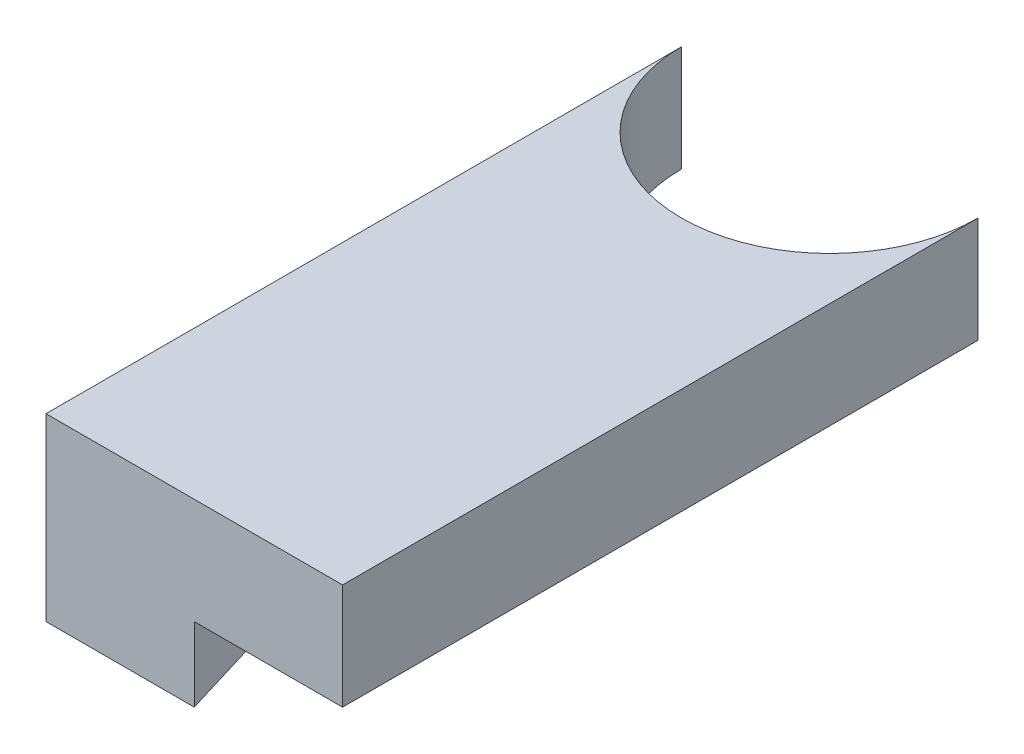
ISO-10303-21;
HEADER;
FILE_DESCRIPTION(('STEP AP214'),'2;1');
FILE_NAME('part.step','',(''),(''),'','','');
FILE_SCHEMA(('AUTOMOTIVE_DESIGN { 1 0 10303 214 1 1 1 1 }'));
ENDSEC;
DATA;
#1=APPLICATION_CONTEXT('core data for automotive mechanical design processes');
#2=APPLICATION_PROTOCOL_DEFINITION('international standard','automotive_design',2000,#1);
#3=PRODUCT_CONTEXT('',#1,'mechanical');
#4=PRODUCT('Part','Part','',(#3));
#5=PRODUCT_RELATED_PRODUCT_CATEGORY('part','',(#4));
#6=PRODUCT_DEFINITION_FORMATION('','',#4);
#7=PRODUCT_DEFINITION_CONTEXT('part definition',#1,'design');
#8=PRODUCT_DEFINITION('design','',#6,#7);
#9=PRODUCT_DEFINITION_SHAPE('','',#8);
#10=(LENGTH_UNIT() NAMED_UNIT(*) SI_UNIT(.MILLI.,.METRE.));
#11=(NAMED_UNIT(*) PLANE_ANGLE_UNIT() SI_UNIT($,.RADIAN.));
#12=(NAMED_UNIT(*) SI_UNIT($,.STERADIAN.) SOLID_ANGLE_UNIT());
#13=UNCERTAINTY_MEASURE_WITH_UNIT(LENGTH_MEASURE(1.E-05),#10,'distance_accuracy_value','');
#14=(GEOMETRIC_REPRESENTATION_CONTEXT(3) GLOBAL_UNCERTAINTY_ASSIGNED_CONTEXT((#13)) GLOBAL_UNIT_ASSIGNED_CONTEXT((#10,
#11,#12)) REPRESENTATION_CONTEXT('',''));
#15=CARTESIAN_POINT('',(0.,0.,0.));
#16=DIRECTION('',(0.,0.,1.));
#17=DIRECTION('',(1.,0.,0.));
#18=AXIS2_PLACEMENT_3D('',#15,#16,#17);
#19=CARTESIAN_POINT('',(3.556,2.54,-15.24));
#20=DIRECTION('',(0.,-1.,0.));
#21=DIRECTION('',(0.,0.,-1.));
#22=AXIS2_PLACEMENT_3D('',#19,#20,#21);
#23=CYLINDRICAL_SURFACE('',#22,3.556);
#24=CARTESIAN_POINT('',(3.556,0.,-15.24));
#25=DIRECTION('',(0.,-1.,0.));
#26=DIRECTION('',(0.,0.,-1.));
#27=AXIS2_PLACEMENT_3D('',#24,#25,#26);
#28=CIRCLE('',#27,3.556);
#29=CARTESIAN_POINT('',(7.112,0.,-15.24));
#30=VERTEX_POINT('',#29);
#31=CARTESIAN_POINT('',(0.,0.,-15.24));
#32=VERTEX_POINT('',#31);
#33=EDGE_CURVE('E114',#30,#32,#28,.T.);
#34=ORIENTED_EDGE('',*,*,#33,.T.);
#35=DIRECTION('',(0.,-1.,0.));
#36=VECTOR('',#35,1.);
#37=CARTESIAN_POINT('',(0.,2.54,-15.24));
#38=LINE('',#37,#36);
#39=CARTESIAN_POINT('',(0.,2.54,-15.24));
#40=VERTEX_POINT('',#39);
#41=EDGE_CURVE('E11',#40,#32,#38,.T.);
#42=ORIENTED_EDGE('',*,*,#41,.F.);
#43=CARTESIAN_POINT('',(3.556,2.54,-15.24));
#44=DIRECTION('',(0.,-1.,0.));
#45=DIRECTION('',(0.,0.,-1.));
#46=AXIS2_PLACEMENT_3D('',#43,#44,#45);
#47=CIRCLE('',#46,3.556);
#48=CARTESIAN_POINT('',(7.112,2.54,-15.24));
#49=VERTEX_POINT('',#48);
#50=EDGE_CURVE('E121',#49,#40,#47,.T.);
#51=ORIENTED_EDGE('',*,*,#50,.F.);
#52=DIRECTION('',(0.,-1.,0.));
#53=VECTOR('',#52,1.);
#54=CARTESIAN_POINT('',(7.112,2.54,-15.24));
#55=LINE('',#54,#53);
#56=EDGE_CURVE('E126',#49,#30,#55,.T.);
#57=ORIENTED_EDGE('',*,*,#56,.T.);
#58=EDGE_LOOP('',(#34,#42,#51,#57));
#59=FACE_BOUND('',#58,.T.);
#60=ADVANCED_FACE('F35',(#59),#23,.F.);
#61=CARTESIAN_POINT('',(0.,2.54,-15.24));
#62=DIRECTION('',(1.,0.,0.));
#63=DIRECTION('',(0.,0.,-1.));
#64=AXIS2_PLACEMENT_3D('',#61,#62,#63);
#65=PLANE('',#64);
#66=DIRECTION('',(0.,0.,1.));
#67=VECTOR('',#66,1.);
#68=CARTESIAN_POINT('',(0.,0.,-15.24));
#69=LINE('',#68,#67);
#70=CARTESIAN_POINT('',(0.,0.,-11.684));
#71=VERTEX_POINT('',#70);
#72=EDGE_CURVE('E113',#32,#71,#69,.T.);
#73=ORIENTED_EDGE('',*,*,#72,.T.);
#74=DIRECTION('',(0.,1.,0.));
#75=VECTOR('',#74,1.);
#76=CARTESIAN_POINT('',(0.,-1.778,-11.684));
#77=LINE('',#76,#75);
#78=CARTESIAN_POINT('',(0.,-1.778,-11.684));
#79=VERTEX_POINT('',#78);
#80=EDGE_CURVE('E100',#79,#71,#77,.T.);
#81=ORIENTED_EDGE('',*,*,#80,.F.);
#82=DIRECTION('',(0.,0.,-1.));
#83=VECTOR('',#82,1.);
#84=CARTESIAN_POINT('',(0.,-1.778,-11.684));
#85=LINE('',#84,#83);
#86=CARTESIAN_POINT('',(0.,-1.778,0.));
#87=VERTEX_POINT('',#86);
#88=EDGE_CURVE('E107',#87,#79,#85,.T.);
#89=ORIENTED_EDGE('',*,*,#88,.F.);
#90=DIRECTION('',(0.,-1.,0.));
#91=VECTOR('',#90,1.);
#92=CARTESIAN_POINT('',(0.,2.54,0.));
#93=LINE('',#92,#91);
#94=CARTESIAN_POINT('',(0.,2.54,0.));
#95=VERTEX_POINT('',#94);
#96=EDGE_CURVE('E42',#95,#87,#93,.T.);
#97=ORIENTED_EDGE('',*,*,#96,.F.);
#98=DIRECTION('',(0.,0.,1.));
#99=VECTOR('',#98,1.);
#100=CARTESIAN_POINT('',(0.,2.54,-15.24));
#101=LINE('',#100,#99);
#102=EDGE_CURVE('E82',#40,#95,#101,.T.);
#103=ORIENTED_EDGE('',*,*,#102,.F.);
#104=ORIENTED_EDGE('',*,*,#41,.T.);
#105=EDGE_LOOP('',(#73,#81,#89,#97,#103,#104));
#106=FACE_BOUND('',#105,.T.);
#107=ADVANCED_FACE('F112',(#106),#65,.F.);
#108=CARTESIAN_POINT('',(0.,2.54,0.));
#109=DIRECTION('',(0.,0.,-1.));
#110=DIRECTION('',(-1.,0.,0.));
#111=AXIS2_PLACEMENT_3D('',#108,#109,#110);
#112=PLANE('',#111);
#113=ORIENTED_EDGE('',*,*,#96,.T.);
#114=DIRECTION('',(-1.,0.,0.));
#115=VECTOR('',#114,1.);
#116=CARTESIAN_POINT('',(0.,-1.778,0.));
#117=LINE('',#116,#115);
#118=CARTESIAN_POINT('',(3.556,-1.778,0.));
#119=VERTEX_POINT('',#118);
#120=EDGE_CURVE('E106',#119,#87,#117,.T.);
#121=ORIENTED_EDGE('',*,*,#120,.F.);
#122=DIRECTION('',(0.,1.,0.));
#123=VECTOR('',#122,1.);
#124=CARTESIAN_POINT('',(3.556,-1.778,0.));
#125=LINE('',#124,#123);
#126=CARTESIAN_POINT('',(3.556,0.,0.));
#127=VERTEX_POINT('',#126);
#128=EDGE_CURVE('E102',#119,#127,#125,.T.);
#129=ORIENTED_EDGE('',*,*,#128,.T.);
#130=DIRECTION('',(1.,0.,0.));
#131=VECTOR('',#130,1.);
#132=CARTESIAN_POINT('',(0.,0.,0.));
#133=LINE('',#132,#131);
#134=CARTESIAN_POINT('',(7.112,0.,0.));
#135=VERTEX_POINT('',#134);
#136=EDGE_CURVE('E129',#127,#135,#133,.T.);
#137=ORIENTED_EDGE('',*,*,#136,.T.);
#138=DIRECTION('',(0.,-1.,0.));
#139=VECTOR('',#138,1.);
#140=CARTESIAN_POINT('',(7.112,2.54,0.));
#141=LINE('',#140,#139);
#142=CARTESIAN_POINT('',(7.112,2.54,0.));
#143=VERTEX_POINT('',#142);
#144=EDGE_CURVE('E133',#143,#135,#141,.T.);
#145=ORIENTED_EDGE('',*,*,#144,.F.);
#146=DIRECTION('',(1.,0.,0.));
#147=VECTOR('',#146,1.);
#148=CARTESIAN_POINT('',(0.,2.54,0.));
#149=LINE('',#148,#147);
#150=EDGE_CURVE('E124',#95,#143,#149,.T.);
#151=ORIENTED_EDGE('',*,*,#150,.F.);
#152=EDGE_LOOP('',(#113,#121,#129,#137,#145,#151));
#153=FACE_BOUND('',#152,.T.);
#154=ADVANCED_FACE('F136',(#153),#112,.F.);
#155=CARTESIAN_POINT('',(7.112,2.54,0.));
#156=DIRECTION('',(-1.,0.,0.));
#157=DIRECTION('',(0.,0.,1.));
#158=AXIS2_PLACEMENT_3D('',#155,#156,#157);
#159=PLANE('',#158);
#160=DIRECTION('',(0.,0.,-1.));
#161=VECTOR('',#160,1.);
#162=CARTESIAN_POINT('',(7.112,0.,0.));
#163=LINE('',#162,#161);
#164=EDGE_CURVE('E75',#135,#30,#163,.T.);
#165=ORIENTED_EDGE('',*,*,#164,.T.);
#166=ORIENTED_EDGE('',*,*,#56,.F.);
#167=DIRECTION('',(0.,0.,-1.));
#168=VECTOR('',#167,1.);
#169=CARTESIAN_POINT('',(7.112,2.54,0.));
#170=LINE('',#169,#168);
#171=EDGE_CURVE('E58',#143,#49,#170,.T.);
#172=ORIENTED_EDGE('',*,*,#171,.F.);
#173=ORIENTED_EDGE('',*,*,#144,.T.);
#174=EDGE_LOOP('',(#165,#166,#172,#173));
#175=FACE_BOUND('',#174,.T.);
#176=ADVANCED_FACE('F145',(#175),#159,.F.);
#177=CARTESIAN_POINT('',(3.556,2.54,-15.24));
#178=DIRECTION('',(0.,-1.,0.));
#179=DIRECTION('',(0.,0.,-1.));
#180=AXIS2_PLACEMENT_3D('',#177,#178,#179);
#181=PLANE('',#180);
#182=ORIENTED_EDGE('',*,*,#50,.T.);
#183=ORIENTED_EDGE('',*,*,#102,.T.);
#184=ORIENTED_EDGE('',*,*,#150,.T.);
#185=ORIENTED_EDGE('',*,*,#171,.T.);
#186=EDGE_LOOP('',(#182,#183,#184,#185));
#187=FACE_BOUND('',#186,.T.);
#188=ADVANCED_FACE('F138',(#187),#181,.F.);
#189=CARTESIAN_POINT('',(3.556,0.,-15.24));
#190=DIRECTION('',(0.,-1.,0.));
#191=DIRECTION('',(0.,0.,-1.));
#192=AXIS2_PLACEMENT_3D('',#189,#190,#191);
#193=PLANE('',#192);
#194=DIRECTION('',(0.291161615782696,0.,0.956673880428858));
#195=VECTOR('',#194,1.);
#196=CARTESIAN_POINT('',(3.556,0.,0.));
#197=LINE('',#196,#195);
#198=EDGE_CURVE('E49',#71,#127,#197,.T.);
#199=ORIENTED_EDGE('',*,*,#198,.F.);
#200=ORIENTED_EDGE('',*,*,#72,.F.);
#201=ORIENTED_EDGE('',*,*,#33,.F.);
#202=ORIENTED_EDGE('',*,*,#164,.F.);
#203=ORIENTED_EDGE('',*,*,#136,.F.);
#204=EDGE_LOOP('',(#199,#200,#201,#202,#203));
#205=FACE_BOUND('',#204,.T.);
#206=ADVANCED_FACE('F143',(#205),#193,.T.);
#207=CARTESIAN_POINT('',(3.556,-1.778,0.));
#208=DIRECTION('',(-0.956673880428859,0.,0.291161615782696));
#209=DIRECTION('',(0.291161615782696,0.,0.956673880428859));
#210=AXIS2_PLACEMENT_3D('',#207,#208,#209);
#211=PLANE('',#210);
#212=ORIENTED_EDGE('',*,*,#198,.T.);
#213=ORIENTED_EDGE('',*,*,#128,.F.);
#214=DIRECTION('',(0.291161615782696,0.,0.956673880428858));
#215=VECTOR('',#214,1.);
#216=CARTESIAN_POINT('',(3.556,-1.778,0.));
#217=LINE('',#216,#215);
#218=EDGE_CURVE('E96',#79,#119,#217,.T.);
#219=ORIENTED_EDGE('',*,*,#218,.F.);
#220=ORIENTED_EDGE('',*,*,#80,.T.);
#221=EDGE_LOOP('',(#212,#213,#219,#220));
#222=FACE_BOUND('',#221,.T.);
#223=ADVANCED_FACE('F98',(#222),#211,.F.);
#224=CARTESIAN_POINT('',(0.,-1.778,0.));
#225=DIRECTION('',(0.,1.,0.));
#226=DIRECTION('',(0.,0.,1.));
#227=AXIS2_PLACEMENT_3D('',#224,#225,#226);
#228=PLANE('',#227);
#229=ORIENTED_EDGE('',*,*,#88,.T.);
#230=ORIENTED_EDGE('',*,*,#218,.T.);
#231=ORIENTED_EDGE('',*,*,#120,.T.);
#232=EDGE_LOOP('',(#229,#230,#231));
#233=FACE_BOUND('',#232,.T.);
#234=ADVANCED_FACE('F110',(#233),#228,.F.);
#235=CLOSED_SHELL('',(#60,#107,#154,#176,#188,#206,#223,#234));
#236=MANIFOLD_SOLID_BREP('B2',#235);
#237=ADVANCED_BREP_SHAPE_REPRESENTATION('',(#18,#236),#14);
#238=SHAPE_DEFINITION_REPRESENTATION(#9,#237);
ENDSEC;
END-ISO-10303-21;
